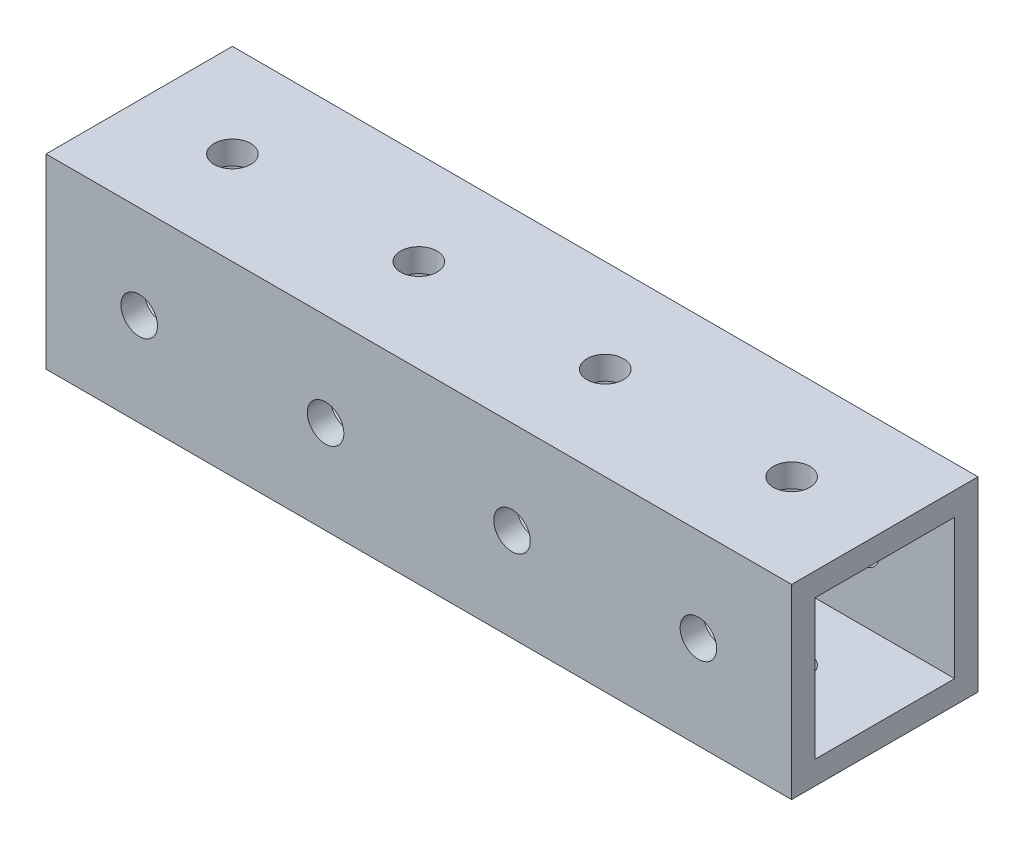
ISO-10303-21;
HEADER;
FILE_DESCRIPTION(('STEP AP214'),'2;1');
FILE_NAME('part.step','',(''),(''),'','','');
FILE_SCHEMA(('AUTOMOTIVE_DESIGN { 1 0 10303 214 1 1 1 1 }'));
ENDSEC;
DATA;
#1=APPLICATION_CONTEXT('core data for automotive mechanical design processes');
#2=APPLICATION_PROTOCOL_DEFINITION('international standard','automotive_design',2000,#1);
#3=PRODUCT_CONTEXT('',#1,'mechanical');
#4=PRODUCT('Part','Part','',(#3));
#5=PRODUCT_RELATED_PRODUCT_CATEGORY('part','',(#4));
#6=PRODUCT_DEFINITION_FORMATION('','',#4);
#7=PRODUCT_DEFINITION_CONTEXT('part definition',#1,'design');
#8=PRODUCT_DEFINITION('design','',#6,#7);
#9=PRODUCT_DEFINITION_SHAPE('','',#8);
#10=(LENGTH_UNIT() NAMED_UNIT(*) SI_UNIT(.MILLI.,.METRE.));
#11=(NAMED_UNIT(*) PLANE_ANGLE_UNIT() SI_UNIT($,.RADIAN.));
#12=(NAMED_UNIT(*) SI_UNIT($,.STERADIAN.) SOLID_ANGLE_UNIT());
#13=UNCERTAINTY_MEASURE_WITH_UNIT(LENGTH_MEASURE(1.E-05),#10,'distance_accuracy_value','');
#14=(GEOMETRIC_REPRESENTATION_CONTEXT(3) GLOBAL_UNCERTAINTY_ASSIGNED_CONTEXT((#13)) GLOBAL_UNIT_ASSIGNED_CONTEXT((#10,
#11,#12)) REPRESENTATION_CONTEXT('',''));
#15=CARTESIAN_POINT('',(0.,0.,0.));
#16=DIRECTION('',(0.,0.,1.));
#17=DIRECTION('',(1.,0.,0.));
#18=AXIS2_PLACEMENT_3D('',#15,#16,#17);
#19=CARTESIAN_POINT('',(139.7,449.326,-25.4));
#20=DIRECTION('',(1.,0.,0.));
#21=DIRECTION('',(0.,0.,-1.));
#22=AXIS2_PLACEMENT_3D('',#19,#20,#21);
#23=PLANE('',#22);
#24=DIRECTION('',(0.,1.,0.));
#25=VECTOR('',#24,1.);
#26=CARTESIAN_POINT('',(139.7,449.326,0.));
#27=LINE('',#26,#25);
#28=CARTESIAN_POINT('',(139.7,449.326,0.));
#29=VERTEX_POINT('',#28);
#30=CARTESIAN_POINT('',(139.7,474.726,0.));
#31=VERTEX_POINT('',#30);
#32=EDGE_CURVE('E135',#29,#31,#27,.T.);
#33=ORIENTED_EDGE('',*,*,#32,.F.);
#34=DIRECTION('',(0.,0.,1.));
#35=VECTOR('',#34,1.);
#36=CARTESIAN_POINT('',(139.7,449.326,-25.4));
#37=LINE('',#36,#35);
#38=CARTESIAN_POINT('',(139.7,449.326,-25.4));
#39=VERTEX_POINT('',#38);
#40=EDGE_CURVE('E11',#39,#29,#37,.T.);
#41=ORIENTED_EDGE('',*,*,#40,.F.);
#42=DIRECTION('',(0.,1.,0.));
#43=VECTOR('',#42,1.);
#44=CARTESIAN_POINT('',(139.7,449.326,-25.4));
#45=LINE('',#44,#43);
#46=CARTESIAN_POINT('',(139.7,474.726,-25.4));
#47=VERTEX_POINT('',#46);
#48=EDGE_CURVE('E140',#39,#47,#45,.T.);
#49=ORIENTED_EDGE('',*,*,#48,.T.);
#50=DIRECTION('',(0.,0.,1.));
#51=VECTOR('',#50,1.);
#52=CARTESIAN_POINT('',(139.7,474.726,-25.4));
#53=LINE('',#52,#51);
#54=EDGE_CURVE('E153',#47,#31,#53,.T.);
#55=ORIENTED_EDGE('',*,*,#54,.T.);
#56=EDGE_LOOP('',(#33,#41,#49,#55));
#57=FACE_BOUND('',#56,.T.);
#58=DIRECTION('',(0.,0.,1.));
#59=VECTOR('',#58,1.);
#60=CARTESIAN_POINT('',(139.7,452.501,-25.4));
#61=LINE('',#60,#59);
#62=CARTESIAN_POINT('',(139.7,452.501,-22.225));
#63=VERTEX_POINT('',#62);
#64=CARTESIAN_POINT('',(139.7,452.501,-3.175));
#65=VERTEX_POINT('',#64);
#66=EDGE_CURVE('E112',#63,#65,#61,.T.);
#67=ORIENTED_EDGE('',*,*,#66,.T.);
#68=DIRECTION('',(0.,1.,0.));
#69=VECTOR('',#68,1.);
#70=CARTESIAN_POINT('',(139.7,0.,-3.175));
#71=LINE('',#70,#69);
#72=CARTESIAN_POINT('',(139.7,471.551,-3.175));
#73=VERTEX_POINT('',#72);
#74=EDGE_CURVE('E121',#65,#73,#71,.T.);
#75=ORIENTED_EDGE('',*,*,#74,.T.);
#76=DIRECTION('',(0.,0.,1.));
#77=VECTOR('',#76,1.);
#78=CARTESIAN_POINT('',(139.7,471.551,-25.4));
#79=LINE('',#78,#77);
#80=CARTESIAN_POINT('',(139.7,471.551,-22.225));
#81=VERTEX_POINT('',#80);
#82=EDGE_CURVE('E130',#81,#73,#79,.T.);
#83=ORIENTED_EDGE('',*,*,#82,.F.);
#84=DIRECTION('',(0.,1.,0.));
#85=VECTOR('',#84,1.);
#86=CARTESIAN_POINT('',(139.7,0.,-22.225));
#87=LINE('',#86,#85);
#88=EDGE_CURVE('E55',#63,#81,#87,.T.);
#89=ORIENTED_EDGE('',*,*,#88,.F.);
#90=EDGE_LOOP('',(#67,#75,#83,#89));
#91=FACE_BOUND('',#90,.T.);
#92=ADVANCED_FACE('F39',(#57,#91),#23,.T.);
#93=CARTESIAN_POINT('',(38.1,449.326,-25.4));
#94=DIRECTION('',(-1.,0.,0.));
#95=DIRECTION('',(0.,0.,1.));
#96=AXIS2_PLACEMENT_3D('',#93,#94,#95);
#97=PLANE('',#96);
#98=DIRECTION('',(0.,-1.,0.));
#99=VECTOR('',#98,1.);
#100=CARTESIAN_POINT('',(38.1,449.326,0.));
#101=LINE('',#100,#99);
#102=CARTESIAN_POINT('',(38.1,474.726,0.));
#103=VERTEX_POINT('',#102);
#104=CARTESIAN_POINT('',(38.1,449.326,0.));
#105=VERTEX_POINT('',#104);
#106=EDGE_CURVE('E159',#103,#105,#101,.T.);
#107=ORIENTED_EDGE('',*,*,#106,.F.);
#108=DIRECTION('',(0.,0.,1.));
#109=VECTOR('',#108,1.);
#110=CARTESIAN_POINT('',(38.1,474.726,-25.4));
#111=LINE('',#110,#109);
#112=CARTESIAN_POINT('',(38.1,474.726,-25.4));
#113=VERTEX_POINT('',#112);
#114=EDGE_CURVE('E165',#113,#103,#111,.T.);
#115=ORIENTED_EDGE('',*,*,#114,.F.);
#116=DIRECTION('',(0.,-1.,0.));
#117=VECTOR('',#116,1.);
#118=CARTESIAN_POINT('',(38.1,449.326,-25.4));
#119=LINE('',#118,#117);
#120=CARTESIAN_POINT('',(38.1,449.326,-25.4));
#121=VERTEX_POINT('',#120);
#122=EDGE_CURVE('E147',#113,#121,#119,.T.);
#123=ORIENTED_EDGE('',*,*,#122,.T.);
#124=DIRECTION('',(0.,0.,1.));
#125=VECTOR('',#124,1.);
#126=CARTESIAN_POINT('',(38.1,449.326,-25.4));
#127=LINE('',#126,#125);
#128=EDGE_CURVE('E47',#121,#105,#127,.T.);
#129=ORIENTED_EDGE('',*,*,#128,.T.);
#130=EDGE_LOOP('',(#107,#115,#123,#129));
#131=FACE_BOUND('',#130,.T.);
#132=DIRECTION('',(0.,0.,1.));
#133=VECTOR('',#132,1.);
#134=CARTESIAN_POINT('',(38.1,471.551,-25.4));
#135=LINE('',#134,#133);
#136=CARTESIAN_POINT('',(38.1,471.551,-22.225));
#137=VERTEX_POINT('',#136);
#138=CARTESIAN_POINT('',(38.1,471.551,-3.175));
#139=VERTEX_POINT('',#138);
#140=EDGE_CURVE('E113',#137,#139,#135,.T.);
#141=ORIENTED_EDGE('',*,*,#140,.T.);
#142=DIRECTION('',(0.,-1.,0.));
#143=VECTOR('',#142,1.);
#144=CARTESIAN_POINT('',(38.1,0.,-3.175));
#145=LINE('',#144,#143);
#146=CARTESIAN_POINT('',(38.1,452.501,-3.175));
#147=VERTEX_POINT('',#146);
#148=EDGE_CURVE('E118',#139,#147,#145,.T.);
#149=ORIENTED_EDGE('',*,*,#148,.T.);
#150=DIRECTION('',(0.,0.,1.));
#151=VECTOR('',#150,1.);
#152=CARTESIAN_POINT('',(38.1,452.501,-25.4));
#153=LINE('',#152,#151);
#154=CARTESIAN_POINT('',(38.1,452.501,-22.225));
#155=VERTEX_POINT('',#154);
#156=EDGE_CURVE('E104',#155,#147,#153,.T.);
#157=ORIENTED_EDGE('',*,*,#156,.F.);
#158=DIRECTION('',(0.,-1.,0.));
#159=VECTOR('',#158,1.);
#160=CARTESIAN_POINT('',(38.1,0.,-22.225));
#161=LINE('',#160,#159);
#162=EDGE_CURVE('E131',#137,#155,#161,.T.);
#163=ORIENTED_EDGE('',*,*,#162,.F.);
#164=EDGE_LOOP('',(#141,#149,#157,#163));
#165=FACE_BOUND('',#164,.T.);
#166=ADVANCED_FACE('F124',(#131,#165),#97,.T.);
#167=CARTESIAN_POINT('',(139.7,449.326,-25.4));
#168=DIRECTION('',(0.,-1.,0.));
#169=DIRECTION('',(0.,0.,-1.));
#170=AXIS2_PLACEMENT_3D('',#167,#168,#169);
#171=PLANE('',#170);
#172=CARTESIAN_POINT('',(50.8000000000095,449.326,-12.7000000000367));
#173=DIRECTION('',(0.,1.,0.));
#174=DIRECTION('',(0.,0.,1.));
#175=AXIS2_PLACEMENT_3D('',#172,#173,#174);
#176=CIRCLE('',#175,2.4892);
#177=CARTESIAN_POINT('',(50.8000000000095,449.326,-10.2108000000368));
#178=VERTEX_POINT('',#177);
#179=EDGE_CURVE('E188',#178,#178,#176,.T.);
#180=ORIENTED_EDGE('',*,*,#179,.T.);
#181=EDGE_LOOP('',(#180));
#182=FACE_BOUND('',#181,.T.);
#183=CARTESIAN_POINT('',(76.2000000000095,449.326,-12.7000000000367));
#184=DIRECTION('',(0.,1.,0.));
#185=DIRECTION('',(0.,0.,1.));
#186=AXIS2_PLACEMENT_3D('',#183,#184,#185);
#187=CIRCLE('',#186,2.4892);
#188=CARTESIAN_POINT('',(76.2000000000095,449.326,-10.2108000000367));
#189=VERTEX_POINT('',#188);
#190=EDGE_CURVE('E376',#189,#189,#187,.T.);
#191=ORIENTED_EDGE('',*,*,#190,.T.);
#192=EDGE_LOOP('',(#191));
#193=FACE_BOUND('',#192,.T.);
#194=CARTESIAN_POINT('',(101.600000000009,449.326,-12.7000000000367));
#195=DIRECTION('',(0.,1.,0.));
#196=DIRECTION('',(0.,0.,1.));
#197=AXIS2_PLACEMENT_3D('',#194,#195,#196);
#198=CIRCLE('',#197,2.4892);
#199=CARTESIAN_POINT('',(101.600000000009,449.326,-10.2108000000367));
#200=VERTEX_POINT('',#199);
#201=EDGE_CURVE('E366',#200,#200,#198,.T.);
#202=ORIENTED_EDGE('',*,*,#201,.T.);
#203=EDGE_LOOP('',(#202));
#204=FACE_BOUND('',#203,.T.);
#205=CARTESIAN_POINT('',(127.000000000009,449.326,-12.7000000000367));
#206=DIRECTION('',(0.,1.,0.));
#207=DIRECTION('',(0.,0.,1.));
#208=AXIS2_PLACEMENT_3D('',#205,#206,#207);
#209=CIRCLE('',#208,2.4892);
#210=CARTESIAN_POINT('',(127.000000000009,449.326,-10.2108000000367));
#211=VERTEX_POINT('',#210);
#212=EDGE_CURVE('E367',#211,#211,#209,.T.);
#213=ORIENTED_EDGE('',*,*,#212,.T.);
#214=EDGE_LOOP('',(#213));
#215=FACE_BOUND('',#214,.T.);
#216=DIRECTION('',(1.,0.,0.));
#217=VECTOR('',#216,1.);
#218=CARTESIAN_POINT('',(139.7,449.326,0.));
#219=LINE('',#218,#217);
#220=EDGE_CURVE('E144',#105,#29,#219,.T.);
#221=ORIENTED_EDGE('',*,*,#220,.F.);
#222=ORIENTED_EDGE('',*,*,#128,.F.);
#223=DIRECTION('',(1.,0.,0.));
#224=VECTOR('',#223,1.);
#225=CARTESIAN_POINT('',(139.7,449.326,-25.4));
#226=LINE('',#225,#224);
#227=EDGE_CURVE('E150',#121,#39,#226,.T.);
#228=ORIENTED_EDGE('',*,*,#227,.T.);
#229=ORIENTED_EDGE('',*,*,#40,.T.);
#230=EDGE_LOOP('',(#221,#222,#228,#229));
#231=FACE_BOUND('',#230,.T.);
#232=ADVANCED_FACE('F251',(#182,#193,#204,#215,#231),#171,.T.);
#233=CARTESIAN_POINT('',(139.7,474.726,-25.4));
#234=DIRECTION('',(0.,1.,0.));
#235=DIRECTION('',(0.,0.,1.));
#236=AXIS2_PLACEMENT_3D('',#233,#234,#235);
#237=PLANE('',#236);
#238=CARTESIAN_POINT('',(50.8000000000095,474.726,-12.7000000000367));
#239=DIRECTION('',(0.,1.,0.));
#240=DIRECTION('',(0.,0.,1.));
#241=AXIS2_PLACEMENT_3D('',#238,#239,#240);
#242=CIRCLE('',#241,2.4892);
#243=CARTESIAN_POINT('',(50.8000000000095,474.726,-10.2108000000368));
#244=VERTEX_POINT('',#243);
#245=EDGE_CURVE('E348',#244,#244,#242,.T.);
#246=ORIENTED_EDGE('',*,*,#245,.F.);
#247=EDGE_LOOP('',(#246));
#248=FACE_BOUND('',#247,.T.);
#249=CARTESIAN_POINT('',(76.2000000000095,474.726,-12.7000000000367));
#250=DIRECTION('',(0.,1.,0.));
#251=DIRECTION('',(0.,0.,1.));
#252=AXIS2_PLACEMENT_3D('',#249,#250,#251);
#253=CIRCLE('',#252,2.4892);
#254=CARTESIAN_POINT('',(76.2000000000095,474.726,-10.2108000000367));
#255=VERTEX_POINT('',#254);
#256=EDGE_CURVE('E379',#255,#255,#253,.T.);
#257=ORIENTED_EDGE('',*,*,#256,.F.);
#258=EDGE_LOOP('',(#257));
#259=FACE_BOUND('',#258,.T.);
#260=CARTESIAN_POINT('',(101.600000000009,474.726,-12.7000000000367));
#261=DIRECTION('',(0.,1.,0.));
#262=DIRECTION('',(0.,0.,1.));
#263=AXIS2_PLACEMENT_3D('',#260,#261,#262);
#264=CIRCLE('',#263,2.4892);
#265=CARTESIAN_POINT('',(101.600000000009,474.726,-10.2108000000367));
#266=VERTEX_POINT('',#265);
#267=EDGE_CURVE('E370',#266,#266,#264,.T.);
#268=ORIENTED_EDGE('',*,*,#267,.F.);
#269=EDGE_LOOP('',(#268));
#270=FACE_BOUND('',#269,.T.);
#271=CARTESIAN_POINT('',(127.000000000009,474.726,-12.7000000000367));
#272=DIRECTION('',(0.,1.,0.));
#273=DIRECTION('',(0.,0.,1.));
#274=AXIS2_PLACEMENT_3D('',#271,#272,#273);
#275=CIRCLE('',#274,2.4892);
#276=CARTESIAN_POINT('',(127.000000000009,474.726,-10.2108000000367));
#277=VERTEX_POINT('',#276);
#278=EDGE_CURVE('E364',#277,#277,#275,.T.);
#279=ORIENTED_EDGE('',*,*,#278,.F.);
#280=EDGE_LOOP('',(#279));
#281=FACE_BOUND('',#280,.T.);
#282=DIRECTION('',(-1.,0.,0.));
#283=VECTOR('',#282,1.);
#284=CARTESIAN_POINT('',(139.7,474.726,0.));
#285=LINE('',#284,#283);
#286=EDGE_CURVE('E156',#31,#103,#285,.T.);
#287=ORIENTED_EDGE('',*,*,#286,.F.);
#288=ORIENTED_EDGE('',*,*,#54,.F.);
#289=DIRECTION('',(-1.,0.,0.));
#290=VECTOR('',#289,1.);
#291=CARTESIAN_POINT('',(139.7,474.726,-25.4));
#292=LINE('',#291,#290);
#293=EDGE_CURVE('E143',#47,#113,#292,.T.);
#294=ORIENTED_EDGE('',*,*,#293,.T.);
#295=ORIENTED_EDGE('',*,*,#114,.T.);
#296=EDGE_LOOP('',(#287,#288,#294,#295));
#297=FACE_BOUND('',#296,.T.);
#298=ADVANCED_FACE('F268',(#248,#259,#270,#281,#297),#237,.T.);
#299=CARTESIAN_POINT('',(0.,0.,-25.4));
#300=DIRECTION('',(0.,0.,1.));
#301=DIRECTION('',(1.,0.,0.));
#302=AXIS2_PLACEMENT_3D('',#299,#300,#301);
#303=PLANE('',#302);
#304=CARTESIAN_POINT('',(50.8,462.026,-25.4));
#305=DIRECTION('',(0.,0.,1.));
#306=DIRECTION('',(1.,0.,0.));
#307=AXIS2_PLACEMENT_3D('',#304,#305,#306);
#308=CIRCLE('',#307,2.48920000000001);
#309=CARTESIAN_POINT('',(53.2892,462.026,-25.4));
#310=VERTEX_POINT('',#309);
#311=EDGE_CURVE('E172',#310,#310,#308,.T.);
#312=ORIENTED_EDGE('',*,*,#311,.T.);
#313=EDGE_LOOP('',(#312));
#314=FACE_BOUND('',#313,.T.);
#315=CARTESIAN_POINT('',(76.2,462.026,-25.4));
#316=DIRECTION('',(0.,0.,1.));
#317=DIRECTION('',(1.,0.,0.));
#318=AXIS2_PLACEMENT_3D('',#315,#316,#317);
#319=CIRCLE('',#318,2.48920000000003);
#320=CARTESIAN_POINT('',(78.6892,462.026,-25.4));
#321=VERTEX_POINT('',#320);
#322=EDGE_CURVE('E218',#321,#321,#319,.T.);
#323=ORIENTED_EDGE('',*,*,#322,.T.);
#324=EDGE_LOOP('',(#323));
#325=FACE_BOUND('',#324,.T.);
#326=CARTESIAN_POINT('',(101.6,462.026,-25.4));
#327=DIRECTION('',(0.,0.,1.));
#328=DIRECTION('',(1.,0.,0.));
#329=AXIS2_PLACEMENT_3D('',#326,#327,#328);
#330=CIRCLE('',#329,2.48920000000002);
#331=CARTESIAN_POINT('',(104.0892,462.026,-25.4));
#332=VERTEX_POINT('',#331);
#333=EDGE_CURVE('E224',#332,#332,#330,.T.);
#334=ORIENTED_EDGE('',*,*,#333,.T.);
#335=EDGE_LOOP('',(#334));
#336=FACE_BOUND('',#335,.T.);
#337=CARTESIAN_POINT('',(127.,462.026,-25.4));
#338=DIRECTION('',(0.,0.,1.));
#339=DIRECTION('',(1.,0.,0.));
#340=AXIS2_PLACEMENT_3D('',#337,#338,#339);
#341=CIRCLE('',#340,2.48920000000001);
#342=CARTESIAN_POINT('',(129.4892,462.026,-25.4));
#343=VERTEX_POINT('',#342);
#344=EDGE_CURVE('E209',#343,#343,#341,.T.);
#345=ORIENTED_EDGE('',*,*,#344,.T.);
#346=EDGE_LOOP('',(#345));
#347=FACE_BOUND('',#346,.T.);
#348=ORIENTED_EDGE('',*,*,#48,.F.);
#349=ORIENTED_EDGE('',*,*,#227,.F.);
#350=ORIENTED_EDGE('',*,*,#122,.F.);
#351=ORIENTED_EDGE('',*,*,#293,.F.);
#352=EDGE_LOOP('',(#348,#349,#350,#351));
#353=FACE_BOUND('',#352,.T.);
#354=ADVANCED_FACE('F265',(#314,#325,#336,#347,#353),#303,.F.);
#355=CARTESIAN_POINT('',(0.,0.,0.));
#356=DIRECTION('',(0.,0.,1.));
#357=DIRECTION('',(1.,0.,0.));
#358=AXIS2_PLACEMENT_3D('',#355,#356,#357);
#359=PLANE('',#358);
#360=CARTESIAN_POINT('',(50.8,462.026,0.));
#361=DIRECTION('',(0.,0.,1.));
#362=DIRECTION('',(1.,0.,0.));
#363=AXIS2_PLACEMENT_3D('',#360,#361,#362);
#364=CIRCLE('',#363,2.48920000000001);
#365=CARTESIAN_POINT('',(53.2892,462.026,0.));
#366=VERTEX_POINT('',#365);
#367=EDGE_CURVE('E212',#366,#366,#364,.T.);
#368=ORIENTED_EDGE('',*,*,#367,.F.);
#369=EDGE_LOOP('',(#368));
#370=FACE_BOUND('',#369,.T.);
#371=CARTESIAN_POINT('',(76.2,462.026,0.));
#372=DIRECTION('',(0.,0.,1.));
#373=DIRECTION('',(1.,0.,0.));
#374=AXIS2_PLACEMENT_3D('',#371,#372,#373);
#375=CIRCLE('',#374,2.48920000000003);
#376=CARTESIAN_POINT('',(78.6892,462.026,0.));
#377=VERTEX_POINT('',#376);
#378=EDGE_CURVE('E215',#377,#377,#375,.T.);
#379=ORIENTED_EDGE('',*,*,#378,.F.);
#380=EDGE_LOOP('',(#379));
#381=FACE_BOUND('',#380,.T.);
#382=CARTESIAN_POINT('',(101.6,462.026,0.));
#383=DIRECTION('',(0.,0.,1.));
#384=DIRECTION('',(1.,0.,0.));
#385=AXIS2_PLACEMENT_3D('',#382,#383,#384);
#386=CIRCLE('',#385,2.48920000000002);
#387=CARTESIAN_POINT('',(104.0892,462.026,0.));
#388=VERTEX_POINT('',#387);
#389=EDGE_CURVE('E221',#388,#388,#386,.T.);
#390=ORIENTED_EDGE('',*,*,#389,.F.);
#391=EDGE_LOOP('',(#390));
#392=FACE_BOUND('',#391,.T.);
#393=CARTESIAN_POINT('',(127.,462.026,0.));
#394=DIRECTION('',(0.,0.,1.));
#395=DIRECTION('',(1.,0.,0.));
#396=AXIS2_PLACEMENT_3D('',#393,#394,#395);
#397=CIRCLE('',#396,2.48920000000001);
#398=CARTESIAN_POINT('',(129.4892,462.026,0.));
#399=VERTEX_POINT('',#398);
#400=EDGE_CURVE('E227',#399,#399,#397,.T.);
#401=ORIENTED_EDGE('',*,*,#400,.F.);
#402=EDGE_LOOP('',(#401));
#403=FACE_BOUND('',#402,.T.);
#404=ORIENTED_EDGE('',*,*,#32,.T.);
#405=ORIENTED_EDGE('',*,*,#286,.T.);
#406=ORIENTED_EDGE('',*,*,#106,.T.);
#407=ORIENTED_EDGE('',*,*,#220,.T.);
#408=EDGE_LOOP('',(#404,#405,#406,#407));
#409=FACE_BOUND('',#408,.T.);
#410=ADVANCED_FACE('F259',(#370,#381,#392,#403,#409),#359,.T.);
#411=CARTESIAN_POINT('',(139.7,452.501,-25.4));
#412=DIRECTION('',(0.,-1.,0.));
#413=DIRECTION('',(0.,0.,-1.));
#414=AXIS2_PLACEMENT_3D('',#411,#412,#413);
#415=PLANE('',#414);
#416=CARTESIAN_POINT('',(50.8000000000095,452.501,-12.7000000000367));
#417=DIRECTION('',(0.,-1.,0.));
#418=DIRECTION('',(0.,0.,-1.));
#419=AXIS2_PLACEMENT_3D('',#416,#417,#418);
#420=CIRCLE('',#419,2.4892);
#421=CARTESIAN_POINT('',(50.8000000000095,452.501,-15.1892000000367));
#422=VERTEX_POINT('',#421);
#423=EDGE_CURVE('E206',#422,#422,#420,.T.);
#424=ORIENTED_EDGE('',*,*,#423,.T.);
#425=EDGE_LOOP('',(#424));
#426=FACE_BOUND('',#425,.T.);
#427=CARTESIAN_POINT('',(76.2000000000095,452.501,-12.7000000000367));
#428=DIRECTION('',(0.,-1.,0.));
#429=DIRECTION('',(0.,0.,-1.));
#430=AXIS2_PLACEMENT_3D('',#427,#428,#429);
#431=CIRCLE('',#430,2.4892);
#432=CARTESIAN_POINT('',(76.2000000000095,452.501,-15.1892000000368));
#433=VERTEX_POINT('',#432);
#434=EDGE_CURVE('E194',#433,#433,#431,.T.);
#435=ORIENTED_EDGE('',*,*,#434,.T.);
#436=EDGE_LOOP('',(#435));
#437=FACE_BOUND('',#436,.T.);
#438=CARTESIAN_POINT('',(101.600000000009,452.501,-12.7000000000367));
#439=DIRECTION('',(0.,-1.,0.));
#440=DIRECTION('',(0.,0.,-1.));
#441=AXIS2_PLACEMENT_3D('',#438,#439,#440);
#442=CIRCLE('',#441,2.4892);
#443=CARTESIAN_POINT('',(101.600000000009,452.501,-15.1892000000368));
#444=VERTEX_POINT('',#443);
#445=EDGE_CURVE('E191',#444,#444,#442,.T.);
#446=ORIENTED_EDGE('',*,*,#445,.T.);
#447=EDGE_LOOP('',(#446));
#448=FACE_BOUND('',#447,.T.);
#449=CARTESIAN_POINT('',(127.000000000009,452.501,-12.7000000000367));
#450=DIRECTION('',(0.,-1.,0.));
#451=DIRECTION('',(0.,0.,-1.));
#452=AXIS2_PLACEMENT_3D('',#449,#450,#451);
#453=CIRCLE('',#452,2.4892);
#454=CARTESIAN_POINT('',(127.000000000009,452.501,-15.1892000000368));
#455=VERTEX_POINT('',#454);
#456=EDGE_CURVE('E187',#455,#455,#453,.T.);
#457=ORIENTED_EDGE('',*,*,#456,.T.);
#458=EDGE_LOOP('',(#457));
#459=FACE_BOUND('',#458,.T.);
#460=DIRECTION('',(1.,0.,0.));
#461=VECTOR('',#460,1.);
#462=CARTESIAN_POINT('',(0.,452.501,-3.175));
#463=LINE('',#462,#461);
#464=EDGE_CURVE('E107',#147,#65,#463,.T.);
#465=ORIENTED_EDGE('',*,*,#464,.T.);
#466=ORIENTED_EDGE('',*,*,#66,.F.);
#467=DIRECTION('',(1.,0.,0.));
#468=VECTOR('',#467,1.);
#469=CARTESIAN_POINT('',(0.,452.501,-22.225));
#470=LINE('',#469,#468);
#471=EDGE_CURVE('E62',#155,#63,#470,.T.);
#472=ORIENTED_EDGE('',*,*,#471,.F.);
#473=ORIENTED_EDGE('',*,*,#156,.T.);
#474=EDGE_LOOP('',(#465,#466,#472,#473));
#475=FACE_BOUND('',#474,.T.);
#476=ADVANCED_FACE('F106',(#426,#437,#448,#459,#475),#415,.F.);
#477=CARTESIAN_POINT('',(139.7,471.551,-25.4));
#478=DIRECTION('',(0.,1.,0.));
#479=DIRECTION('',(0.,0.,1.));
#480=AXIS2_PLACEMENT_3D('',#477,#478,#479);
#481=PLANE('',#480);
#482=CARTESIAN_POINT('',(50.8000000000095,471.551,-12.7000000000367));
#483=DIRECTION('',(0.,1.,0.));
#484=DIRECTION('',(0.,0.,1.));
#485=AXIS2_PLACEMENT_3D('',#482,#483,#484);
#486=CIRCLE('',#485,2.4892);
#487=CARTESIAN_POINT('',(50.8000000000095,471.551,-10.2108000000368));
#488=VERTEX_POINT('',#487);
#489=EDGE_CURVE('E42',#488,#488,#486,.T.);
#490=ORIENTED_EDGE('',*,*,#489,.T.);
#491=EDGE_LOOP('',(#490));
#492=FACE_BOUND('',#491,.T.);
#493=CARTESIAN_POINT('',(76.2000000000095,471.551,-12.7000000000367));
#494=DIRECTION('',(0.,1.,0.));
#495=DIRECTION('',(0.,0.,1.));
#496=AXIS2_PLACEMENT_3D('',#493,#494,#495);
#497=CIRCLE('',#496,2.4892);
#498=CARTESIAN_POINT('',(76.2000000000095,471.551,-10.2108000000367));
#499=VERTEX_POINT('',#498);
#500=EDGE_CURVE('E192',#499,#499,#497,.T.);
#501=ORIENTED_EDGE('',*,*,#500,.T.);
#502=EDGE_LOOP('',(#501));
#503=FACE_BOUND('',#502,.T.);
#504=CARTESIAN_POINT('',(101.600000000009,471.551,-12.7000000000367));
#505=DIRECTION('',(0.,1.,0.));
#506=DIRECTION('',(0.,0.,1.));
#507=AXIS2_PLACEMENT_3D('',#504,#505,#506);
#508=CIRCLE('',#507,2.4892);
#509=CARTESIAN_POINT('',(101.600000000009,471.551,-10.2108000000367));
#510=VERTEX_POINT('',#509);
#511=EDGE_CURVE('E189',#510,#510,#508,.T.);
#512=ORIENTED_EDGE('',*,*,#511,.T.);
#513=EDGE_LOOP('',(#512));
#514=FACE_BOUND('',#513,.T.);
#515=CARTESIAN_POINT('',(127.000000000009,471.551,-12.7000000000367));
#516=DIRECTION('',(0.,1.,0.));
#517=DIRECTION('',(0.,0.,1.));
#518=AXIS2_PLACEMENT_3D('',#515,#516,#517);
#519=CIRCLE('',#518,2.4892);
#520=CARTESIAN_POINT('',(127.000000000009,471.551,-10.2108000000367));
#521=VERTEX_POINT('',#520);
#522=EDGE_CURVE('E184',#521,#521,#519,.T.);
#523=ORIENTED_EDGE('',*,*,#522,.T.);
#524=EDGE_LOOP('',(#523));
#525=FACE_BOUND('',#524,.T.);
#526=DIRECTION('',(-1.,0.,0.));
#527=VECTOR('',#526,1.);
#528=CARTESIAN_POINT('',(0.,471.551,-3.175));
#529=LINE('',#528,#527);
#530=EDGE_CURVE('E125',#73,#139,#529,.T.);
#531=ORIENTED_EDGE('',*,*,#530,.T.);
#532=ORIENTED_EDGE('',*,*,#140,.F.);
#533=DIRECTION('',(-1.,0.,0.));
#534=VECTOR('',#533,1.);
#535=CARTESIAN_POINT('',(0.,471.551,-22.225));
#536=LINE('',#535,#534);
#537=EDGE_CURVE('E133',#81,#137,#536,.T.);
#538=ORIENTED_EDGE('',*,*,#537,.F.);
#539=ORIENTED_EDGE('',*,*,#82,.T.);
#540=EDGE_LOOP('',(#531,#532,#538,#539));
#541=FACE_BOUND('',#540,.T.);
#542=ADVANCED_FACE('F244',(#492,#503,#514,#525,#541),#481,.F.);
#543=CARTESIAN_POINT('',(0.,0.,-22.225));
#544=DIRECTION('',(0.,0.,1.));
#545=DIRECTION('',(1.,0.,0.));
#546=AXIS2_PLACEMENT_3D('',#543,#544,#545);
#547=PLANE('',#546);
#548=CARTESIAN_POINT('',(50.8,462.026,-22.225));
#549=DIRECTION('',(0.,0.,1.));
#550=DIRECTION('',(1.,0.,0.));
#551=AXIS2_PLACEMENT_3D('',#548,#549,#550);
#552=CIRCLE('',#551,2.48920000000001);
#553=CARTESIAN_POINT('',(53.2892,462.026,-22.225));
#554=VERTEX_POINT('',#553);
#555=EDGE_CURVE('E139',#554,#554,#552,.T.);
#556=ORIENTED_EDGE('',*,*,#555,.F.);
#557=EDGE_LOOP('',(#556));
#558=FACE_BOUND('',#557,.T.);
#559=CARTESIAN_POINT('',(76.2,462.026,-22.225));
#560=DIRECTION('',(0.,0.,1.));
#561=DIRECTION('',(1.,0.,0.));
#562=AXIS2_PLACEMENT_3D('',#559,#560,#561);
#563=CIRCLE('',#562,2.48920000000003);
#564=CARTESIAN_POINT('',(78.6892,462.026,-22.225));
#565=VERTEX_POINT('',#564);
#566=EDGE_CURVE('E180',#565,#565,#563,.T.);
#567=ORIENTED_EDGE('',*,*,#566,.F.);
#568=EDGE_LOOP('',(#567));
#569=FACE_BOUND('',#568,.T.);
#570=CARTESIAN_POINT('',(101.6,462.026,-22.225));
#571=DIRECTION('',(0.,0.,1.));
#572=DIRECTION('',(1.,0.,0.));
#573=AXIS2_PLACEMENT_3D('',#570,#571,#572);
#574=CIRCLE('',#573,2.48920000000002);
#575=CARTESIAN_POINT('',(104.0892,462.026,-22.225));
#576=VERTEX_POINT('',#575);
#577=EDGE_CURVE('E176',#576,#576,#574,.T.);
#578=ORIENTED_EDGE('',*,*,#577,.F.);
#579=EDGE_LOOP('',(#578));
#580=FACE_BOUND('',#579,.T.);
#581=CARTESIAN_POINT('',(127.,462.026,-22.225));
#582=DIRECTION('',(0.,0.,1.));
#583=DIRECTION('',(1.,0.,0.));
#584=AXIS2_PLACEMENT_3D('',#581,#582,#583);
#585=CIRCLE('',#584,2.48920000000001);
#586=CARTESIAN_POINT('',(129.4892,462.026,-22.225));
#587=VERTEX_POINT('',#586);
#588=EDGE_CURVE('E171',#587,#587,#585,.T.);
#589=ORIENTED_EDGE('',*,*,#588,.F.);
#590=EDGE_LOOP('',(#589));
#591=FACE_BOUND('',#590,.T.);
#592=ORIENTED_EDGE('',*,*,#88,.T.);
#593=ORIENTED_EDGE('',*,*,#537,.T.);
#594=ORIENTED_EDGE('',*,*,#162,.T.);
#595=ORIENTED_EDGE('',*,*,#471,.T.);
#596=EDGE_LOOP('',(#592,#593,#594,#595));
#597=FACE_BOUND('',#596,.T.);
#598=ADVANCED_FACE('F241',(#558,#569,#580,#591,#597),#547,.T.);
#599=CARTESIAN_POINT('',(0.,0.,-3.175));
#600=DIRECTION('',(0.,0.,1.));
#601=DIRECTION('',(1.,0.,0.));
#602=AXIS2_PLACEMENT_3D('',#599,#600,#601);
#603=PLANE('',#602);
#604=CARTESIAN_POINT('',(50.8,462.026,-3.175));
#605=DIRECTION('',(0.,0.,1.));
#606=DIRECTION('',(1.,0.,0.));
#607=AXIS2_PLACEMENT_3D('',#604,#605,#606);
#608=CIRCLE('',#607,2.48920000000001);
#609=CARTESIAN_POINT('',(53.2892,462.026,-3.175));
#610=VERTEX_POINT('',#609);
#611=EDGE_CURVE('E181',#610,#610,#608,.T.);
#612=ORIENTED_EDGE('',*,*,#611,.T.);
#613=EDGE_LOOP('',(#612));
#614=FACE_BOUND('',#613,.T.);
#615=CARTESIAN_POINT('',(76.2,462.026,-3.175));
#616=DIRECTION('',(0.,0.,1.));
#617=DIRECTION('',(1.,0.,0.));
#618=AXIS2_PLACEMENT_3D('',#615,#616,#617);
#619=CIRCLE('',#618,2.48920000000003);
#620=CARTESIAN_POINT('',(78.6892,462.026,-3.175));
#621=VERTEX_POINT('',#620);
#622=EDGE_CURVE('E177',#621,#621,#619,.T.);
#623=ORIENTED_EDGE('',*,*,#622,.T.);
#624=EDGE_LOOP('',(#623));
#625=FACE_BOUND('',#624,.T.);
#626=CARTESIAN_POINT('',(101.6,462.026,-3.175));
#627=DIRECTION('',(0.,0.,1.));
#628=DIRECTION('',(1.,0.,0.));
#629=AXIS2_PLACEMENT_3D('',#626,#627,#628);
#630=CIRCLE('',#629,2.48920000000002);
#631=CARTESIAN_POINT('',(104.0892,462.026,-3.175));
#632=VERTEX_POINT('',#631);
#633=EDGE_CURVE('E173',#632,#632,#630,.T.);
#634=ORIENTED_EDGE('',*,*,#633,.T.);
#635=EDGE_LOOP('',(#634));
#636=FACE_BOUND('',#635,.T.);
#637=CARTESIAN_POINT('',(127.,462.026,-3.175));
#638=DIRECTION('',(0.,0.,1.));
#639=DIRECTION('',(1.,0.,0.));
#640=AXIS2_PLACEMENT_3D('',#637,#638,#639);
#641=CIRCLE('',#640,2.48920000000001);
#642=CARTESIAN_POINT('',(129.4892,462.026,-3.175));
#643=VERTEX_POINT('',#642);
#644=EDGE_CURVE('E168',#643,#643,#641,.T.);
#645=ORIENTED_EDGE('',*,*,#644,.T.);
#646=EDGE_LOOP('',(#645));
#647=FACE_BOUND('',#646,.T.);
#648=ORIENTED_EDGE('',*,*,#74,.F.);
#649=ORIENTED_EDGE('',*,*,#464,.F.);
#650=ORIENTED_EDGE('',*,*,#148,.F.);
#651=ORIENTED_EDGE('',*,*,#530,.F.);
#652=EDGE_LOOP('',(#648,#649,#650,#651));
#653=FACE_BOUND('',#652,.T.);
#654=ADVANCED_FACE('F116',(#614,#625,#636,#647,#653),#603,.F.);
#655=CARTESIAN_POINT('',(127.,462.026,-25.4));
#656=DIRECTION('',(0.,0.,1.));
#657=DIRECTION('',(1.,0.,0.));
#658=AXIS2_PLACEMENT_3D('',#655,#656,#657);
#659=CYLINDRICAL_SURFACE('',#658,2.48920000000001);
#660=ORIENTED_EDGE('',*,*,#400,.T.);
#661=EDGE_LOOP('',(#660));
#662=FACE_BOUND('',#661,.T.);
#663=ORIENTED_EDGE('',*,*,#644,.F.);
#664=EDGE_LOOP('',(#663));
#665=FACE_BOUND('',#664,.T.);
#666=ADVANCED_FACE('F288',(#662,#665),#659,.F.);
#667=CARTESIAN_POINT('',(101.6,462.026,-25.4));
#668=DIRECTION('',(0.,0.,1.));
#669=DIRECTION('',(1.,0.,0.));
#670=AXIS2_PLACEMENT_3D('',#667,#668,#669);
#671=CYLINDRICAL_SURFACE('',#670,2.48920000000002);
#672=ORIENTED_EDGE('',*,*,#389,.T.);
#673=EDGE_LOOP('',(#672));
#674=FACE_BOUND('',#673,.T.);
#675=ORIENTED_EDGE('',*,*,#633,.F.);
#676=EDGE_LOOP('',(#675));
#677=FACE_BOUND('',#676,.T.);
#678=ADVANCED_FACE('F308',(#674,#677),#671,.F.);
#679=CARTESIAN_POINT('',(76.2,462.026,-25.4));
#680=DIRECTION('',(0.,0.,1.));
#681=DIRECTION('',(1.,0.,0.));
#682=AXIS2_PLACEMENT_3D('',#679,#680,#681);
#683=CYLINDRICAL_SURFACE('',#682,2.48920000000003);
#684=ORIENTED_EDGE('',*,*,#378,.T.);
#685=EDGE_LOOP('',(#684));
#686=FACE_BOUND('',#685,.T.);
#687=ORIENTED_EDGE('',*,*,#622,.F.);
#688=EDGE_LOOP('',(#687));
#689=FACE_BOUND('',#688,.T.);
#690=ADVANCED_FACE('F313',(#686,#689),#683,.F.);
#691=CARTESIAN_POINT('',(50.8,462.026,-25.4));
#692=DIRECTION('',(0.,0.,1.));
#693=DIRECTION('',(1.,0.,0.));
#694=AXIS2_PLACEMENT_3D('',#691,#692,#693);
#695=CYLINDRICAL_SURFACE('',#694,2.48920000000001);
#696=ORIENTED_EDGE('',*,*,#367,.T.);
#697=EDGE_LOOP('',(#696));
#698=FACE_BOUND('',#697,.T.);
#699=ORIENTED_EDGE('',*,*,#611,.F.);
#700=EDGE_LOOP('',(#699));
#701=FACE_BOUND('',#700,.T.);
#702=ADVANCED_FACE('F302',(#698,#701),#695,.F.);
#703=ORIENTED_EDGE('',*,*,#588,.T.);
#704=EDGE_LOOP('',(#703));
#705=FACE_BOUND('',#704,.T.);
#706=ORIENTED_EDGE('',*,*,#344,.F.);
#707=EDGE_LOOP('',(#706));
#708=FACE_BOUND('',#707,.T.);
#709=ADVANCED_FACE('F298',(#705,#708),#659,.F.);
#710=ORIENTED_EDGE('',*,*,#577,.T.);
#711=EDGE_LOOP('',(#710));
#712=FACE_BOUND('',#711,.T.);
#713=ORIENTED_EDGE('',*,*,#333,.F.);
#714=EDGE_LOOP('',(#713));
#715=FACE_BOUND('',#714,.T.);
#716=ADVANCED_FACE('F301',(#712,#715),#671,.F.);
#717=ORIENTED_EDGE('',*,*,#566,.T.);
#718=EDGE_LOOP('',(#717));
#719=FACE_BOUND('',#718,.T.);
#720=ORIENTED_EDGE('',*,*,#322,.F.);
#721=EDGE_LOOP('',(#720));
#722=FACE_BOUND('',#721,.T.);
#723=ADVANCED_FACE('F306',(#719,#722),#683,.F.);
#724=ORIENTED_EDGE('',*,*,#555,.T.);
#725=EDGE_LOOP('',(#724));
#726=FACE_BOUND('',#725,.T.);
#727=ORIENTED_EDGE('',*,*,#311,.F.);
#728=EDGE_LOOP('',(#727));
#729=FACE_BOUND('',#728,.T.);
#730=ADVANCED_FACE('F311',(#726,#729),#695,.F.);
#731=CARTESIAN_POINT('',(127.000000000009,449.326,-12.7000000000367));
#732=DIRECTION('',(0.,1.,0.));
#733=DIRECTION('',(0.,0.,1.));
#734=AXIS2_PLACEMENT_3D('',#731,#732,#733);
#735=CYLINDRICAL_SURFACE('',#734,2.4892);
#736=ORIENTED_EDGE('',*,*,#278,.T.);
#737=EDGE_LOOP('',(#736));
#738=FACE_BOUND('',#737,.T.);
#739=ORIENTED_EDGE('',*,*,#522,.F.);
#740=EDGE_LOOP('',(#739));
#741=FACE_BOUND('',#740,.T.);
#742=ADVANCED_FACE('F316',(#738,#741),#735,.F.);
#743=CARTESIAN_POINT('',(101.600000000009,449.326,-12.7000000000367));
#744=DIRECTION('',(0.,1.,0.));
#745=DIRECTION('',(0.,0.,1.));
#746=AXIS2_PLACEMENT_3D('',#743,#744,#745);
#747=CYLINDRICAL_SURFACE('',#746,2.4892);
#748=ORIENTED_EDGE('',*,*,#267,.T.);
#749=EDGE_LOOP('',(#748));
#750=FACE_BOUND('',#749,.T.);
#751=ORIENTED_EDGE('',*,*,#511,.F.);
#752=EDGE_LOOP('',(#751));
#753=FACE_BOUND('',#752,.T.);
#754=ADVANCED_FACE('F328',(#750,#753),#747,.F.);
#755=CARTESIAN_POINT('',(76.2000000000095,449.326,-12.7000000000367));
#756=DIRECTION('',(0.,1.,0.));
#757=DIRECTION('',(0.,0.,1.));
#758=AXIS2_PLACEMENT_3D('',#755,#756,#757);
#759=CYLINDRICAL_SURFACE('',#758,2.4892);
#760=ORIENTED_EDGE('',*,*,#256,.T.);
#761=EDGE_LOOP('',(#760));
#762=FACE_BOUND('',#761,.T.);
#763=ORIENTED_EDGE('',*,*,#500,.F.);
#764=EDGE_LOOP('',(#763));
#765=FACE_BOUND('',#764,.T.);
#766=ADVANCED_FACE('F333',(#762,#765),#759,.F.);
#767=CARTESIAN_POINT('',(50.8000000000095,449.326,-12.7000000000367));
#768=DIRECTION('',(0.,1.,0.));
#769=DIRECTION('',(0.,0.,1.));
#770=AXIS2_PLACEMENT_3D('',#767,#768,#769);
#771=CYLINDRICAL_SURFACE('',#770,2.4892);
#772=ORIENTED_EDGE('',*,*,#245,.T.);
#773=EDGE_LOOP('',(#772));
#774=FACE_BOUND('',#773,.T.);
#775=ORIENTED_EDGE('',*,*,#489,.F.);
#776=EDGE_LOOP('',(#775));
#777=FACE_BOUND('',#776,.T.);
#778=ADVANCED_FACE('F322',(#774,#777),#771,.F.);
#779=ORIENTED_EDGE('',*,*,#212,.F.);
#780=EDGE_LOOP('',(#779));
#781=FACE_BOUND('',#780,.T.);
#782=ORIENTED_EDGE('',*,*,#456,.F.);
#783=EDGE_LOOP('',(#782));
#784=FACE_BOUND('',#783,.T.);
#785=ADVANCED_FACE('F318',(#781,#784),#735,.F.);
#786=ORIENTED_EDGE('',*,*,#201,.F.);
#787=EDGE_LOOP('',(#786));
#788=FACE_BOUND('',#787,.T.);
#789=ORIENTED_EDGE('',*,*,#445,.F.);
#790=EDGE_LOOP('',(#789));
#791=FACE_BOUND('',#790,.T.);
#792=ADVANCED_FACE('F321',(#788,#791),#747,.F.);
#793=ORIENTED_EDGE('',*,*,#190,.F.);
#794=EDGE_LOOP('',(#793));
#795=FACE_BOUND('',#794,.T.);
#796=ORIENTED_EDGE('',*,*,#434,.F.);
#797=EDGE_LOOP('',(#796));
#798=FACE_BOUND('',#797,.T.);
#799=ADVANCED_FACE('F326',(#795,#798),#759,.F.);
#800=ORIENTED_EDGE('',*,*,#179,.F.);
#801=EDGE_LOOP('',(#800));
#802=FACE_BOUND('',#801,.T.);
#803=ORIENTED_EDGE('',*,*,#423,.F.);
#804=EDGE_LOOP('',(#803));
#805=FACE_BOUND('',#804,.T.);
#806=ADVANCED_FACE('F331',(#802,#805),#771,.F.);
#807=CLOSED_SHELL('',(#92,#166,#232,#298,#354,#410,#476,#542,#598,#654,#666,#678,#690,#702,#709,
#716,#723,#730,#742,#754,#766,#778,#785,#792,#799,#806));
#808=MANIFOLD_SOLID_BREP('B2',#807);
#809=ADVANCED_BREP_SHAPE_REPRESENTATION('',(#18,#808),#14);
#810=SHAPE_DEFINITION_REPRESENTATION(#9,#809);
ENDSEC;
END-ISO-10303-21;
